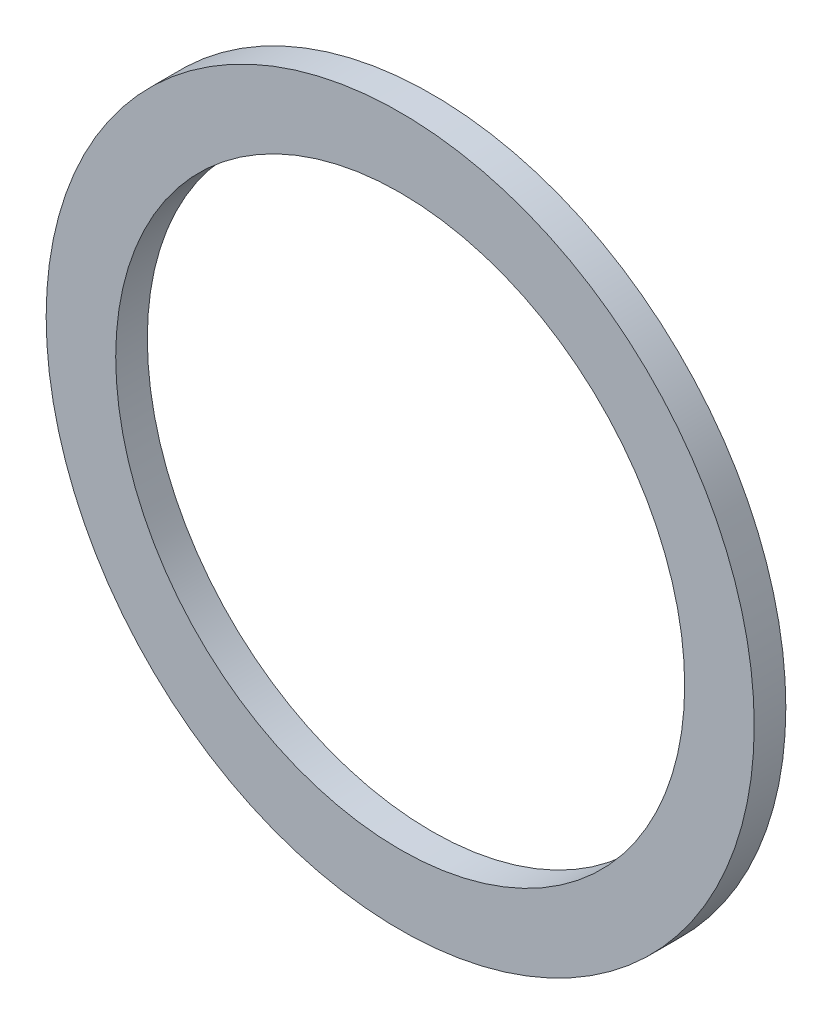
ISO-10303-21;
HEADER;
FILE_DESCRIPTION(('STEP AP214'),'2;1');
FILE_NAME('part.step','',(''),(''),'','','');
FILE_SCHEMA(('AUTOMOTIVE_DESIGN { 1 0 10303 214 1 1 1 1 }'));
ENDSEC;
DATA;
#1=APPLICATION_CONTEXT('core data for automotive mechanical design processes');
#2=APPLICATION_PROTOCOL_DEFINITION('international standard','automotive_design',2000,#1);
#3=PRODUCT_CONTEXT('',#1,'mechanical');
#4=PRODUCT('Part','Part','',(#3));
#5=PRODUCT_RELATED_PRODUCT_CATEGORY('part','',(#4));
#6=PRODUCT_DEFINITION_FORMATION('','',#4);
#7=PRODUCT_DEFINITION_CONTEXT('part definition',#1,'design');
#8=PRODUCT_DEFINITION('design','',#6,#7);
#9=PRODUCT_DEFINITION_SHAPE('','',#8);
#10=(LENGTH_UNIT() NAMED_UNIT(*) SI_UNIT(.MILLI.,.METRE.));
#11=(NAMED_UNIT(*) PLANE_ANGLE_UNIT() SI_UNIT($,.RADIAN.));
#12=(NAMED_UNIT(*) SI_UNIT($,.STERADIAN.) SOLID_ANGLE_UNIT());
#13=UNCERTAINTY_MEASURE_WITH_UNIT(LENGTH_MEASURE(1.E-05),#10,'distance_accuracy_value','');
#14=(GEOMETRIC_REPRESENTATION_CONTEXT(3) GLOBAL_UNCERTAINTY_ASSIGNED_CONTEXT((#13)) GLOBAL_UNIT_ASSIGNED_CONTEXT((#10,
#11,#12)) REPRESENTATION_CONTEXT('',''));
#15=CARTESIAN_POINT('',(0.,0.,0.));
#16=DIRECTION('',(0.,0.,1.));
#17=DIRECTION('',(1.,0.,0.));
#18=AXIS2_PLACEMENT_3D('',#15,#16,#17);
#19=CARTESIAN_POINT('',(0.,0.,1.));
#20=DIRECTION('',(0.,0.,1.));
#21=DIRECTION('',(1.,0.,0.));
#22=AXIS2_PLACEMENT_3D('',#19,#20,#21);
#23=PLANE('',#22);
#24=CARTESIAN_POINT('',(0.,0.,1.));
#25=DIRECTION('',(0.,0.,1.));
#26=DIRECTION('',(1.,0.,0.));
#27=AXIS2_PLACEMENT_3D('',#24,#25,#26);
#28=CIRCLE('',#27,11.2);
#29=CARTESIAN_POINT('',(11.2,0.,1.));
#30=VERTEX_POINT('',#29);
#31=EDGE_CURVE('E10',#30,#30,#28,.T.);
#32=ORIENTED_EDGE('',*,*,#31,.T.);
#33=EDGE_LOOP('',(#32));
#34=FACE_BOUND('',#33,.T.);
#35=CARTESIAN_POINT('',(0.,0.,1.));
#36=DIRECTION('',(0.,0.,1.));
#37=DIRECTION('',(1.,0.,0.));
#38=AXIS2_PLACEMENT_3D('',#35,#36,#37);
#39=CIRCLE('',#38,9.);
#40=CARTESIAN_POINT('',(9.,0.,1.));
#41=VERTEX_POINT('',#40);
#42=EDGE_CURVE('E41',#41,#41,#39,.T.);
#43=ORIENTED_EDGE('',*,*,#42,.F.);
#44=EDGE_LOOP('',(#43));
#45=FACE_BOUND('',#44,.T.);
#46=ADVANCED_FACE('F30',(#34,#45),#23,.T.);
#47=CARTESIAN_POINT('',(0.,0.,0.));
#48=DIRECTION('',(0.,0.,1.));
#49=DIRECTION('',(1.,0.,0.));
#50=AXIS2_PLACEMENT_3D('',#47,#48,#49);
#51=PLANE('',#50);
#52=CARTESIAN_POINT('',(0.,0.,0.));
#53=DIRECTION('',(0.,0.,1.));
#54=DIRECTION('',(1.,0.,0.));
#55=AXIS2_PLACEMENT_3D('',#52,#53,#54);
#56=CIRCLE('',#55,11.2);
#57=CARTESIAN_POINT('',(11.2,0.,0.));
#58=VERTEX_POINT('',#57);
#59=EDGE_CURVE('E34',#58,#58,#56,.T.);
#60=ORIENTED_EDGE('',*,*,#59,.F.);
#61=EDGE_LOOP('',(#60));
#62=FACE_BOUND('',#61,.T.);
#63=CARTESIAN_POINT('',(0.,0.,0.));
#64=DIRECTION('',(0.,0.,1.));
#65=DIRECTION('',(1.,0.,0.));
#66=AXIS2_PLACEMENT_3D('',#63,#64,#65);
#67=CIRCLE('',#66,9.);
#68=CARTESIAN_POINT('',(9.,0.,0.));
#69=VERTEX_POINT('',#68);
#70=EDGE_CURVE('E43',#69,#69,#67,.T.);
#71=ORIENTED_EDGE('',*,*,#70,.T.);
#72=EDGE_LOOP('',(#71));
#73=FACE_BOUND('',#72,.T.);
#74=ADVANCED_FACE('F53',(#62,#73),#51,.F.);
#75=CARTESIAN_POINT('',(0.,0.,1.));
#76=DIRECTION('',(0.,0.,-1.));
#77=DIRECTION('',(-1.,0.,0.));
#78=AXIS2_PLACEMENT_3D('',#75,#76,#77);
#79=CYLINDRICAL_SURFACE('',#78,11.2);
#80=ORIENTED_EDGE('',*,*,#31,.F.);
#81=EDGE_LOOP('',(#80));
#82=FACE_BOUND('',#81,.T.);
#83=ORIENTED_EDGE('',*,*,#59,.T.);
#84=EDGE_LOOP('',(#83));
#85=FACE_BOUND('',#84,.T.);
#86=ADVANCED_FACE('F32',(#82,#85),#79,.T.);
#87=CARTESIAN_POINT('',(0.,0.,1.));
#88=DIRECTION('',(0.,0.,-1.));
#89=DIRECTION('',(-1.,0.,0.));
#90=AXIS2_PLACEMENT_3D('',#87,#88,#89);
#91=CYLINDRICAL_SURFACE('',#90,9.);
#92=ORIENTED_EDGE('',*,*,#42,.T.);
#93=EDGE_LOOP('',(#92));
#94=FACE_BOUND('',#93,.T.);
#95=ORIENTED_EDGE('',*,*,#70,.F.);
#96=EDGE_LOOP('',(#95));
#97=FACE_BOUND('',#96,.T.);
#98=ADVANCED_FACE('F49',(#94,#97),#91,.F.);
#99=CLOSED_SHELL('',(#46,#74,#86,#98));
#100=MANIFOLD_SOLID_BREP('B2',#99);
#101=ADVANCED_BREP_SHAPE_REPRESENTATION('',(#18,#100),#14);
#102=SHAPE_DEFINITION_REPRESENTATION(#9,#101);
ENDSEC;
END-ISO-10303-21;
